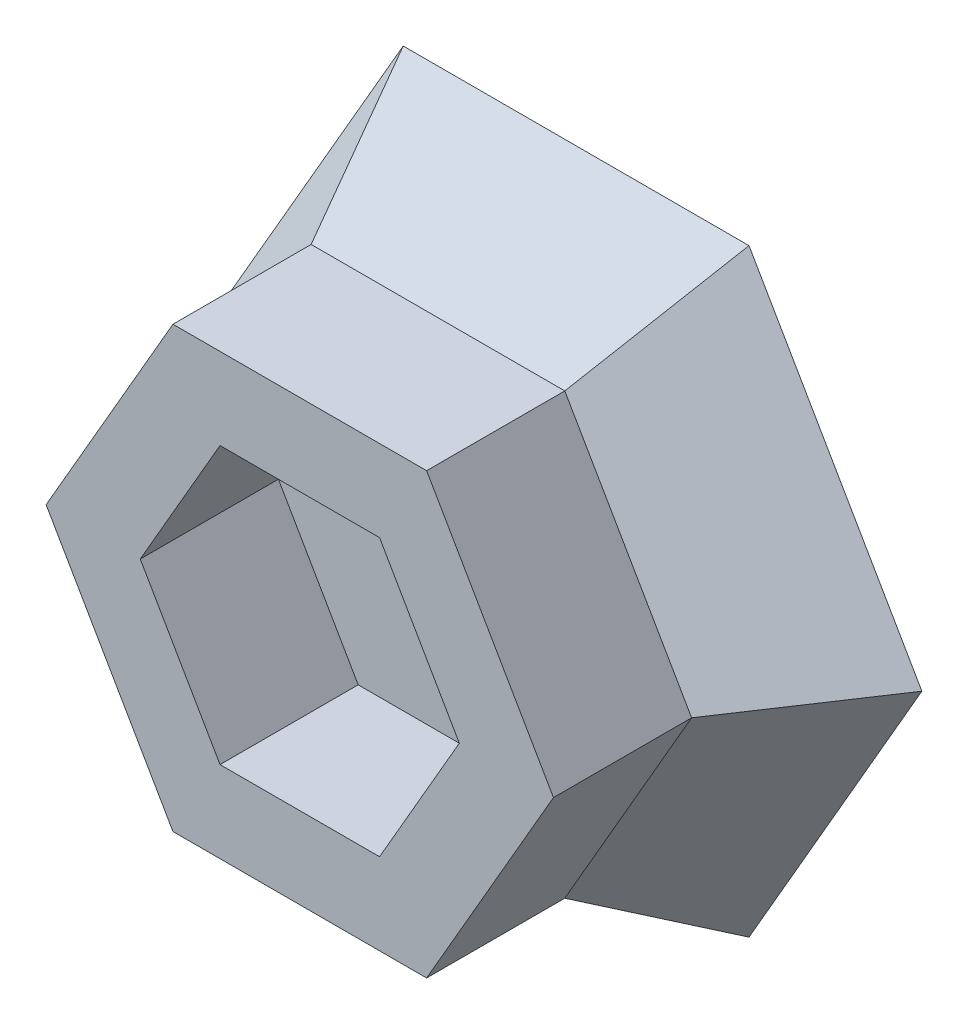
ISO-10303-21;
HEADER;
FILE_DESCRIPTION(('STEP AP214'),'2;1');
FILE_NAME('part.step','',(''),(''),'','','');
FILE_SCHEMA(('AUTOMOTIVE_DESIGN { 1 0 10303 214 1 1 1 1 }'));
ENDSEC;
DATA;
#1=APPLICATION_CONTEXT('core data for automotive mechanical design processes');
#2=APPLICATION_PROTOCOL_DEFINITION('international standard','automotive_design',2000,#1);
#3=PRODUCT_CONTEXT('',#1,'mechanical');
#4=PRODUCT('Part','Part','',(#3));
#5=PRODUCT_RELATED_PRODUCT_CATEGORY('part','',(#4));
#6=PRODUCT_DEFINITION_FORMATION('','',#4);
#7=PRODUCT_DEFINITION_CONTEXT('part definition',#1,'design');
#8=PRODUCT_DEFINITION('design','',#6,#7);
#9=PRODUCT_DEFINITION_SHAPE('','',#8);
#10=(LENGTH_UNIT() NAMED_UNIT(*) SI_UNIT(.MILLI.,.METRE.));
#11=(NAMED_UNIT(*) PLANE_ANGLE_UNIT() SI_UNIT($,.RADIAN.));
#12=(NAMED_UNIT(*) SI_UNIT($,.STERADIAN.) SOLID_ANGLE_UNIT());
#13=UNCERTAINTY_MEASURE_WITH_UNIT(LENGTH_MEASURE(1.E-05),#10,'distance_accuracy_value','');
#14=(GEOMETRIC_REPRESENTATION_CONTEXT(3) GLOBAL_UNCERTAINTY_ASSIGNED_CONTEXT((#13)) GLOBAL_UNIT_ASSIGNED_CONTEXT((#10,
#11,#12)) REPRESENTATION_CONTEXT('',''));
#15=CARTESIAN_POINT('',(0.,0.,0.));
#16=DIRECTION('',(0.,0.,1.));
#17=DIRECTION('',(1.,0.,0.));
#18=AXIS2_PLACEMENT_3D('',#15,#16,#17);
#19=CARTESIAN_POINT('',(0.,0.,5.));
#20=DIRECTION('',(0.,0.,1.));
#21=DIRECTION('',(1.,0.,0.));
#22=AXIS2_PLACEMENT_3D('',#19,#20,#21);
#23=PLANE('',#22);
#24=DIRECTION('',(0.5,0.866025403784439,0.));
#25=VECTOR('',#24,1.);
#26=CARTESIAN_POINT('',(4.58993464005753,-7.95000000000001,5.));
#27=LINE('',#26,#25);
#28=CARTESIAN_POINT('',(4.58993464005753,-7.95000000000001,5.));
#29=VERTEX_POINT('',#28);
#30=CARTESIAN_POINT('',(9.17986928011505,0.,5.));
#31=VERTEX_POINT('',#30);
#32=EDGE_CURVE('E159',#29,#31,#27,.T.);
#33=ORIENTED_EDGE('',*,*,#32,.T.);
#34=DIRECTION('',(-0.5,0.866025403784439,0.));
#35=VECTOR('',#34,1.);
#36=CARTESIAN_POINT('',(9.17986928011505,0.,5.));
#37=LINE('',#36,#35);
#38=CARTESIAN_POINT('',(4.58993464005753,7.95000000000001,5.));
#39=VERTEX_POINT('',#38);
#40=EDGE_CURVE('E170',#31,#39,#37,.T.);
#41=ORIENTED_EDGE('',*,*,#40,.T.);
#42=DIRECTION('',(-1.,0.,0.));
#43=VECTOR('',#42,1.);
#44=CARTESIAN_POINT('',(4.58993464005753,7.95000000000001,5.));
#45=LINE('',#44,#43);
#46=CARTESIAN_POINT('',(-4.58993464005753,7.95000000000001,5.));
#47=VERTEX_POINT('',#46);
#48=EDGE_CURVE('E121',#39,#47,#45,.T.);
#49=ORIENTED_EDGE('',*,*,#48,.T.);
#50=DIRECTION('',(-0.5,-0.866025403784439,0.));
#51=VECTOR('',#50,1.);
#52=CARTESIAN_POINT('',(-4.58993464005753,7.95000000000001,5.));
#53=LINE('',#52,#51);
#54=CARTESIAN_POINT('',(-9.17986928011505,0.,5.));
#55=VERTEX_POINT('',#54);
#56=EDGE_CURVE('E114',#47,#55,#53,.T.);
#57=ORIENTED_EDGE('',*,*,#56,.T.);
#58=DIRECTION('',(0.5,-0.866025403784439,0.));
#59=VECTOR('',#58,1.);
#60=CARTESIAN_POINT('',(-9.17986928011505,0.,5.));
#61=LINE('',#60,#59);
#62=CARTESIAN_POINT('',(-4.58993464005753,-7.95000000000001,5.));
#63=VERTEX_POINT('',#62);
#64=EDGE_CURVE('E118',#55,#63,#61,.T.);
#65=ORIENTED_EDGE('',*,*,#64,.T.);
#66=DIRECTION('',(1.,0.,0.));
#67=VECTOR('',#66,1.);
#68=CARTESIAN_POINT('',(-4.58993464005753,-7.95000000000001,5.));
#69=LINE('',#68,#67);
#70=EDGE_CURVE('E63',#63,#29,#69,.T.);
#71=ORIENTED_EDGE('',*,*,#70,.T.);
#72=EDGE_LOOP('',(#33,#41,#49,#57,#65,#71));
#73=FACE_BOUND('',#72,.T.);
#74=DIRECTION('',(-0.5,0.866025403784438,0.));
#75=VECTOR('',#74,1.);
#76=CARTESIAN_POINT('',(5.77350269189626,0.,5.));
#77=LINE('',#76,#75);
#78=CARTESIAN_POINT('',(5.77350269189626,0.,5.));
#79=VERTEX_POINT('',#78);
#80=CARTESIAN_POINT('',(2.88675134594813,5.,5.));
#81=VERTEX_POINT('',#80);
#82=EDGE_CURVE('E231',#79,#81,#77,.T.);
#83=ORIENTED_EDGE('',*,*,#82,.F.);
#84=DIRECTION('',(0.5,0.866025403784439,0.));
#85=VECTOR('',#84,1.);
#86=CARTESIAN_POINT('',(2.88675134594813,-5.,5.));
#87=LINE('',#86,#85);
#88=CARTESIAN_POINT('',(2.88675134594813,-5.,5.));
#89=VERTEX_POINT('',#88);
#90=EDGE_CURVE('E265',#89,#79,#87,.T.);
#91=ORIENTED_EDGE('',*,*,#90,.F.);
#92=DIRECTION('',(1.,0.,0.));
#93=VECTOR('',#92,1.);
#94=CARTESIAN_POINT('',(-2.88675134594813,-5.,5.));
#95=LINE('',#94,#93);
#96=CARTESIAN_POINT('',(-2.88675134594813,-5.,5.));
#97=VERTEX_POINT('',#96);
#98=EDGE_CURVE('E85',#97,#89,#95,.T.);
#99=ORIENTED_EDGE('',*,*,#98,.F.);
#100=DIRECTION('',(0.5,-0.866025403784439,0.));
#101=VECTOR('',#100,1.);
#102=CARTESIAN_POINT('',(-5.77350269189626,0.,5.));
#103=LINE('',#102,#101);
#104=CARTESIAN_POINT('',(-5.77350269189626,0.,5.));
#105=VERTEX_POINT('',#104);
#106=EDGE_CURVE('E242',#105,#97,#103,.T.);
#107=ORIENTED_EDGE('',*,*,#106,.F.);
#108=DIRECTION('',(-0.5,-0.866025403784439,0.));
#109=VECTOR('',#108,1.);
#110=CARTESIAN_POINT('',(-2.88675134594813,5.,5.));
#111=LINE('',#110,#109);
#112=CARTESIAN_POINT('',(-2.88675134594813,5.,5.));
#113=VERTEX_POINT('',#112);
#114=EDGE_CURVE('E230',#113,#105,#111,.T.);
#115=ORIENTED_EDGE('',*,*,#114,.F.);
#116=DIRECTION('',(-1.,0.,0.));
#117=VECTOR('',#116,1.);
#118=CARTESIAN_POINT('',(2.88675134594813,5.,5.));
#119=LINE('',#118,#117);
#120=EDGE_CURVE('E221',#81,#113,#119,.T.);
#121=ORIENTED_EDGE('',*,*,#120,.F.);
#122=EDGE_LOOP('',(#83,#91,#99,#107,#115,#121));
#123=FACE_BOUND('',#122,.T.);
#124=ADVANCED_FACE('F39',(#73,#123),#23,.T.);
#125=CARTESIAN_POINT('',(4.58993464005753,-7.95000000000001,5.));
#126=DIRECTION('',(-0.866025403784439,0.5,0.));
#127=DIRECTION('',(-0.5,-0.866025403784439,0.));
#128=AXIS2_PLACEMENT_3D('',#125,#126,#127);
#129=PLANE('',#128);
#130=DIRECTION('',(0.5,0.866025403784439,0.));
#131=VECTOR('',#130,1.);
#132=CARTESIAN_POINT('',(4.58993464005753,-7.95000000000001,0.));
#133=LINE('',#132,#131);
#134=CARTESIAN_POINT('',(4.58993464005753,-7.95000000000001,0.));
#135=VERTEX_POINT('',#134);
#136=CARTESIAN_POINT('',(9.17986928011505,0.,0.));
#137=VERTEX_POINT('',#136);
#138=EDGE_CURVE('E145',#135,#137,#133,.T.);
#139=ORIENTED_EDGE('',*,*,#138,.T.);
#140=DIRECTION('',(0.,0.,-1.));
#141=VECTOR('',#140,1.);
#142=CARTESIAN_POINT('',(9.17986928011505,0.,5.));
#143=LINE('',#142,#141);
#144=EDGE_CURVE('E11',#31,#137,#143,.T.);
#145=ORIENTED_EDGE('',*,*,#144,.F.);
#146=ORIENTED_EDGE('',*,*,#32,.F.);
#147=DIRECTION('',(0.,0.,-1.));
#148=VECTOR('',#147,1.);
#149=CARTESIAN_POINT('',(4.58993464005753,-7.95000000000001,5.));
#150=LINE('',#149,#148);
#151=EDGE_CURVE('E141',#29,#135,#150,.T.);
#152=ORIENTED_EDGE('',*,*,#151,.T.);
#153=EDGE_LOOP('',(#139,#145,#146,#152));
#154=FACE_BOUND('',#153,.T.);
#155=ADVANCED_FACE('F41',(#154),#129,.F.);
#156=CARTESIAN_POINT('',(9.17986928011505,0.,5.));
#157=DIRECTION('',(-0.866025403784439,-0.5,0.));
#158=DIRECTION('',(0.5,-0.866025403784439,0.));
#159=AXIS2_PLACEMENT_3D('',#156,#157,#158);
#160=PLANE('',#159);
#161=DIRECTION('',(-0.5,0.866025403784439,0.));
#162=VECTOR('',#161,1.);
#163=CARTESIAN_POINT('',(9.17986928011505,0.,0.));
#164=LINE('',#163,#162);
#165=CARTESIAN_POINT('',(4.58993464005753,7.95000000000001,0.));
#166=VERTEX_POINT('',#165);
#167=EDGE_CURVE('E148',#137,#166,#164,.T.);
#168=ORIENTED_EDGE('',*,*,#167,.T.);
#169=DIRECTION('',(0.,0.,-1.));
#170=VECTOR('',#169,1.);
#171=CARTESIAN_POINT('',(4.58993464005753,7.95000000000001,5.));
#172=LINE('',#171,#170);
#173=EDGE_CURVE('E47',#39,#166,#172,.T.);
#174=ORIENTED_EDGE('',*,*,#173,.F.);
#175=ORIENTED_EDGE('',*,*,#40,.F.);
#176=ORIENTED_EDGE('',*,*,#144,.T.);
#177=EDGE_LOOP('',(#168,#174,#175,#176));
#178=FACE_BOUND('',#177,.T.);
#179=ADVANCED_FACE('F169',(#178),#160,.F.);
#180=CARTESIAN_POINT('',(4.58993464005753,7.95000000000001,5.));
#181=DIRECTION('',(0.,-1.,0.));
#182=DIRECTION('',(1.,0.,0.));
#183=AXIS2_PLACEMENT_3D('',#180,#181,#182);
#184=PLANE('',#183);
#185=DIRECTION('',(-1.,0.,0.));
#186=VECTOR('',#185,1.);
#187=CARTESIAN_POINT('',(4.58993464005753,7.95000000000001,0.));
#188=LINE('',#187,#186);
#189=CARTESIAN_POINT('',(-4.58993464005753,7.95000000000001,0.));
#190=VERTEX_POINT('',#189);
#191=EDGE_CURVE('E76',#166,#190,#188,.T.);
#192=ORIENTED_EDGE('',*,*,#191,.T.);
#193=DIRECTION('',(0.,0.,-1.));
#194=VECTOR('',#193,1.);
#195=CARTESIAN_POINT('',(-4.58993464005753,7.95000000000001,5.));
#196=LINE('',#195,#194);
#197=EDGE_CURVE('E135',#47,#190,#196,.T.);
#198=ORIENTED_EDGE('',*,*,#197,.F.);
#199=ORIENTED_EDGE('',*,*,#48,.F.);
#200=ORIENTED_EDGE('',*,*,#173,.T.);
#201=EDGE_LOOP('',(#192,#198,#199,#200));
#202=FACE_BOUND('',#201,.T.);
#203=ADVANCED_FACE('F166',(#202),#184,.F.);
#204=CARTESIAN_POINT('',(-4.58993464005753,7.95000000000001,5.));
#205=DIRECTION('',(0.866025403784439,-0.5,0.));
#206=DIRECTION('',(0.5,0.866025403784439,0.));
#207=AXIS2_PLACEMENT_3D('',#204,#205,#206);
#208=PLANE('',#207);
#209=DIRECTION('',(-0.5,-0.866025403784439,0.));
#210=VECTOR('',#209,1.);
#211=CARTESIAN_POINT('',(-4.58993464005753,7.95000000000001,0.));
#212=LINE('',#211,#210);
#213=CARTESIAN_POINT('',(-9.17986928011505,0.,0.));
#214=VERTEX_POINT('',#213);
#215=EDGE_CURVE('E132',#190,#214,#212,.T.);
#216=ORIENTED_EDGE('',*,*,#215,.T.);
#217=DIRECTION('',(0.,0.,-1.));
#218=VECTOR('',#217,1.);
#219=CARTESIAN_POINT('',(-9.17986928011505,0.,5.));
#220=LINE('',#219,#218);
#221=EDGE_CURVE('E128',#55,#214,#220,.T.);
#222=ORIENTED_EDGE('',*,*,#221,.F.);
#223=ORIENTED_EDGE('',*,*,#56,.F.);
#224=ORIENTED_EDGE('',*,*,#197,.T.);
#225=EDGE_LOOP('',(#216,#222,#223,#224));
#226=FACE_BOUND('',#225,.T.);
#227=ADVANCED_FACE('F129',(#226),#208,.F.);
#228=CARTESIAN_POINT('',(-9.17986928011505,0.,5.));
#229=DIRECTION('',(0.866025403784439,0.5,0.));
#230=DIRECTION('',(-0.5,0.866025403784439,0.));
#231=AXIS2_PLACEMENT_3D('',#228,#229,#230);
#232=PLANE('',#231);
#233=DIRECTION('',(0.5,-0.866025403784439,0.));
#234=VECTOR('',#233,1.);
#235=CARTESIAN_POINT('',(-9.17986928011505,0.,0.));
#236=LINE('',#235,#234);
#237=CARTESIAN_POINT('',(-4.58993464005753,-7.95000000000001,0.));
#238=VERTEX_POINT('',#237);
#239=EDGE_CURVE('E154',#214,#238,#236,.T.);
#240=ORIENTED_EDGE('',*,*,#239,.T.);
#241=DIRECTION('',(0.,0.,-1.));
#242=VECTOR('',#241,1.);
#243=CARTESIAN_POINT('',(-4.58993464005753,-7.95000000000001,5.));
#244=LINE('',#243,#242);
#245=EDGE_CURVE('E136',#63,#238,#244,.T.);
#246=ORIENTED_EDGE('',*,*,#245,.F.);
#247=ORIENTED_EDGE('',*,*,#64,.F.);
#248=ORIENTED_EDGE('',*,*,#221,.T.);
#249=EDGE_LOOP('',(#240,#246,#247,#248));
#250=FACE_BOUND('',#249,.T.);
#251=ADVANCED_FACE('F138',(#250),#232,.F.);
#252=CARTESIAN_POINT('',(-4.58993464005753,-7.95000000000001,5.));
#253=DIRECTION('',(0.,1.,0.));
#254=DIRECTION('',(0.,0.,1.));
#255=AXIS2_PLACEMENT_3D('',#252,#253,#254);
#256=PLANE('',#255);
#257=DIRECTION('',(1.,0.,0.));
#258=VECTOR('',#257,1.);
#259=CARTESIAN_POINT('',(-4.58993464005753,-7.95000000000001,0.));
#260=LINE('',#259,#258);
#261=EDGE_CURVE('E156',#238,#135,#260,.T.);
#262=ORIENTED_EDGE('',*,*,#261,.T.);
#263=ORIENTED_EDGE('',*,*,#151,.F.);
#264=ORIENTED_EDGE('',*,*,#70,.F.);
#265=ORIENTED_EDGE('',*,*,#245,.T.);
#266=EDGE_LOOP('',(#262,#263,#264,#265));
#267=FACE_BOUND('',#266,.T.);
#268=ADVANCED_FACE('F280',(#267),#256,.F.);
#269=CARTESIAN_POINT('',(2.88675134594813,-5.,5.));
#270=DIRECTION('',(-0.866025403784439,0.5,0.));
#271=DIRECTION('',(-0.5,-0.866025403784439,0.));
#272=AXIS2_PLACEMENT_3D('',#269,#270,#271);
#273=PLANE('',#272);
#274=DIRECTION('',(0.5,0.866025403784439,0.));
#275=VECTOR('',#274,1.);
#276=CARTESIAN_POINT('',(2.88675134594813,-5.,0.));
#277=LINE('',#276,#275);
#278=CARTESIAN_POINT('',(2.88675134594813,-5.,0.));
#279=VERTEX_POINT('',#278);
#280=CARTESIAN_POINT('',(5.77350269189626,0.,0.));
#281=VERTEX_POINT('',#280);
#282=EDGE_CURVE('E249',#279,#281,#277,.T.);
#283=ORIENTED_EDGE('',*,*,#282,.F.);
#284=DIRECTION('',(0.,0.,-1.));
#285=VECTOR('',#284,1.);
#286=CARTESIAN_POINT('',(2.88675134594813,-5.,5.));
#287=LINE('',#286,#285);
#288=EDGE_CURVE('E248',#89,#279,#287,.T.);
#289=ORIENTED_EDGE('',*,*,#288,.F.);
#290=ORIENTED_EDGE('',*,*,#90,.T.);
#291=DIRECTION('',(0.,0.,-1.));
#292=VECTOR('',#291,1.);
#293=CARTESIAN_POINT('',(5.77350269189626,0.,5.));
#294=LINE('',#293,#292);
#295=EDGE_CURVE('E149',#79,#281,#294,.T.);
#296=ORIENTED_EDGE('',*,*,#295,.T.);
#297=EDGE_LOOP('',(#283,#289,#290,#296));
#298=FACE_BOUND('',#297,.T.);
#299=ADVANCED_FACE('F319',(#298),#273,.T.);
#300=CARTESIAN_POINT('',(5.77350269189626,0.,5.));
#301=DIRECTION('',(-0.866025403784438,-0.5,0.));
#302=DIRECTION('',(0.5,-0.866025403784438,0.));
#303=AXIS2_PLACEMENT_3D('',#300,#301,#302);
#304=PLANE('',#303);
#305=DIRECTION('',(-0.5,0.866025403784438,0.));
#306=VECTOR('',#305,1.);
#307=CARTESIAN_POINT('',(5.77350269189626,0.,0.));
#308=LINE('',#307,#306);
#309=CARTESIAN_POINT('',(2.88675134594813,5.,0.));
#310=VERTEX_POINT('',#309);
#311=EDGE_CURVE('E252',#281,#310,#308,.T.);
#312=ORIENTED_EDGE('',*,*,#311,.F.);
#313=ORIENTED_EDGE('',*,*,#295,.F.);
#314=ORIENTED_EDGE('',*,*,#82,.T.);
#315=DIRECTION('',(0.,0.,-1.));
#316=VECTOR('',#315,1.);
#317=CARTESIAN_POINT('',(2.88675134594813,5.,5.));
#318=LINE('',#317,#316);
#319=EDGE_CURVE('E227',#81,#310,#318,.T.);
#320=ORIENTED_EDGE('',*,*,#319,.T.);
#321=EDGE_LOOP('',(#312,#313,#314,#320));
#322=FACE_BOUND('',#321,.T.);
#323=ADVANCED_FACE('F315',(#322),#304,.T.);
#324=CARTESIAN_POINT('',(2.88675134594813,5.,5.));
#325=DIRECTION('',(0.,-1.,0.));
#326=DIRECTION('',(0.,0.,-1.));
#327=AXIS2_PLACEMENT_3D('',#324,#325,#326);
#328=PLANE('',#327);
#329=DIRECTION('',(-1.,0.,0.));
#330=VECTOR('',#329,1.);
#331=CARTESIAN_POINT('',(2.88675134594813,5.,0.));
#332=LINE('',#331,#330);
#333=CARTESIAN_POINT('',(-2.88675134594813,5.,0.));
#334=VERTEX_POINT('',#333);
#335=EDGE_CURVE('E256',#310,#334,#332,.T.);
#336=ORIENTED_EDGE('',*,*,#335,.F.);
#337=ORIENTED_EDGE('',*,*,#319,.F.);
#338=ORIENTED_EDGE('',*,*,#120,.T.);
#339=DIRECTION('',(0.,0.,-1.));
#340=VECTOR('',#339,1.);
#341=CARTESIAN_POINT('',(-2.88675134594813,5.,5.));
#342=LINE('',#341,#340);
#343=EDGE_CURVE('E225',#113,#334,#342,.T.);
#344=ORIENTED_EDGE('',*,*,#343,.T.);
#345=EDGE_LOOP('',(#336,#337,#338,#344));
#346=FACE_BOUND('',#345,.T.);
#347=ADVANCED_FACE('F224',(#346),#328,.T.);
#348=CARTESIAN_POINT('',(-2.88675134594813,5.,5.));
#349=DIRECTION('',(0.866025403784439,-0.5,0.));
#350=DIRECTION('',(0.5,0.866025403784439,0.));
#351=AXIS2_PLACEMENT_3D('',#348,#349,#350);
#352=PLANE('',#351);
#353=DIRECTION('',(-0.5,-0.866025403784439,0.));
#354=VECTOR('',#353,1.);
#355=CARTESIAN_POINT('',(-2.88675134594813,5.,0.));
#356=LINE('',#355,#354);
#357=CARTESIAN_POINT('',(-5.77350269189626,0.,0.));
#358=VERTEX_POINT('',#357);
#359=EDGE_CURVE('E237',#334,#358,#356,.T.);
#360=ORIENTED_EDGE('',*,*,#359,.F.);
#361=ORIENTED_EDGE('',*,*,#343,.F.);
#362=ORIENTED_EDGE('',*,*,#114,.T.);
#363=DIRECTION('',(0.,0.,-1.));
#364=VECTOR('',#363,1.);
#365=CARTESIAN_POINT('',(-5.77350269189626,0.,5.));
#366=LINE('',#365,#364);
#367=EDGE_CURVE('E239',#105,#358,#366,.T.);
#368=ORIENTED_EDGE('',*,*,#367,.T.);
#369=EDGE_LOOP('',(#360,#361,#362,#368));
#370=FACE_BOUND('',#369,.T.);
#371=ADVANCED_FACE('F234',(#370),#352,.T.);
#372=CARTESIAN_POINT('',(-5.77350269189626,0.,5.));
#373=DIRECTION('',(0.866025403784438,0.5,0.));
#374=DIRECTION('',(-0.5,0.866025403784439,0.));
#375=AXIS2_PLACEMENT_3D('',#372,#373,#374);
#376=PLANE('',#375);
#377=DIRECTION('',(0.5,-0.866025403784439,0.));
#378=VECTOR('',#377,1.);
#379=CARTESIAN_POINT('',(-5.77350269189626,0.,0.));
#380=LINE('',#379,#378);
#381=CARTESIAN_POINT('',(-2.88675134594813,-5.,0.));
#382=VERTEX_POINT('',#381);
#383=EDGE_CURVE('E259',#358,#382,#380,.T.);
#384=ORIENTED_EDGE('',*,*,#383,.F.);
#385=ORIENTED_EDGE('',*,*,#367,.F.);
#386=ORIENTED_EDGE('',*,*,#106,.T.);
#387=DIRECTION('',(0.,0.,-1.));
#388=VECTOR('',#387,1.);
#389=CARTESIAN_POINT('',(-2.88675134594813,-5.,5.));
#390=LINE('',#389,#388);
#391=EDGE_CURVE('E54',#97,#382,#390,.T.);
#392=ORIENTED_EDGE('',*,*,#391,.T.);
#393=EDGE_LOOP('',(#384,#385,#386,#392));
#394=FACE_BOUND('',#393,.T.);
#395=ADVANCED_FACE('F325',(#394),#376,.T.);
#396=CARTESIAN_POINT('',(-2.88675134594813,-5.,5.));
#397=DIRECTION('',(0.,1.,0.));
#398=DIRECTION('',(0.,0.,1.));
#399=AXIS2_PLACEMENT_3D('',#396,#397,#398);
#400=PLANE('',#399);
#401=DIRECTION('',(1.,0.,0.));
#402=VECTOR('',#401,1.);
#403=CARTESIAN_POINT('',(-2.88675134594813,-5.,0.));
#404=LINE('',#403,#402);
#405=EDGE_CURVE('E262',#382,#279,#404,.T.);
#406=ORIENTED_EDGE('',*,*,#405,.F.);
#407=ORIENTED_EDGE('',*,*,#391,.F.);
#408=ORIENTED_EDGE('',*,*,#98,.T.);
#409=ORIENTED_EDGE('',*,*,#288,.T.);
#410=EDGE_LOOP('',(#406,#407,#408,#409));
#411=FACE_BOUND('',#410,.T.);
#412=ADVANCED_FACE('F320',(#411),#400,.T.);
#413=CARTESIAN_POINT('',(0.,0.,0.));
#414=DIRECTION('',(0.,0.,1.));
#415=DIRECTION('',(1.,0.,0.));
#416=AXIS2_PLACEMENT_3D('',#413,#414,#415);
#417=PLANE('',#416);
#418=ORIENTED_EDGE('',*,*,#405,.T.);
#419=ORIENTED_EDGE('',*,*,#282,.T.);
#420=ORIENTED_EDGE('',*,*,#311,.T.);
#421=ORIENTED_EDGE('',*,*,#335,.T.);
#422=ORIENTED_EDGE('',*,*,#359,.T.);
#423=ORIENTED_EDGE('',*,*,#383,.T.);
#424=EDGE_LOOP('',(#418,#419,#420,#421,#422,#423));
#425=FACE_BOUND('',#424,.T.);
#426=ADVANCED_FACE('F323',(#425),#417,.T.);
#427=CARTESIAN_POINT('',(0.,-7.95000000000001,0.));
#428=DIRECTION('',(0.,-0.866025403784438,0.500000000000001));
#429=DIRECTION('',(0.,-0.500000000000001,-0.866025403784438));
#430=AXIS2_PLACEMENT_3D('',#427,#428,#429);
#431=PLANE('',#430);
#432=ORIENTED_EDGE('',*,*,#261,.F.);
#433=DIRECTION('',(0.277350098112615,0.480384461415262,0.832050294337843));
#434=VECTOR('',#433,1.);
#435=CARTESIAN_POINT('',(-4.23686274466848,-7.33846153846154,1.05921568616712));
#436=LINE('',#435,#434);
#437=CARTESIAN_POINT('',(-6.2566013067242,-10.8367513459481,-5.));
#438=VERTEX_POINT('',#437);
#439=EDGE_CURVE('E253',#438,#238,#436,.T.);
#440=ORIENTED_EDGE('',*,*,#439,.F.);
#441=DIRECTION('',(1.,0.,0.));
#442=VECTOR('',#441,1.);
#443=CARTESIAN_POINT('',(0.,-10.8367513459481,-5.));
#444=LINE('',#443,#442);
#445=CARTESIAN_POINT('',(6.2566013067242,-10.8367513459481,-5.));
#446=VERTEX_POINT('',#445);
#447=EDGE_CURVE('E301',#438,#446,#444,.T.);
#448=ORIENTED_EDGE('',*,*,#447,.T.);
#449=DIRECTION('',(-0.277350098112615,0.480384461415262,0.832050294337843));
#450=VECTOR('',#449,1.);
#451=CARTESIAN_POINT('',(4.23686274466849,-7.33846153846154,1.05921568616712));
#452=LINE('',#451,#450);
#453=EDGE_CURVE('E276',#446,#135,#452,.T.);
#454=ORIENTED_EDGE('',*,*,#453,.T.);
#455=EDGE_LOOP('',(#432,#440,#448,#454));
#456=FACE_BOUND('',#455,.T.);
#457=ADVANCED_FACE('F282',(#456),#431,.T.);
#458=CARTESIAN_POINT('',(-6.88490196008629,-3.975,0.));
#459=DIRECTION('',(-0.75,-0.433012701892219,0.500000000000001));
#460=DIRECTION('',(0.55470019622523,0.,0.832050294337843));
#461=AXIS2_PLACEMENT_3D('',#458,#459,#460);
#462=PLANE('',#461);
#463=ORIENTED_EDGE('',*,*,#239,.F.);
#464=DIRECTION('',(0.55470019622523,0.,0.832050294337843));
#465=VECTOR('',#464,1.);
#466=CARTESIAN_POINT('',(-8.47372548933697,0.,1.05921568616712));
#467=LINE('',#466,#465);
#468=CARTESIAN_POINT('',(-12.5132026134484,0.,-5.));
#469=VERTEX_POINT('',#468);
#470=EDGE_CURVE('E289',#469,#214,#467,.T.);
#471=ORIENTED_EDGE('',*,*,#470,.F.);
#472=DIRECTION('',(0.5,-0.866025403784439,0.));
#473=VECTOR('',#472,1.);
#474=CARTESIAN_POINT('',(-9.3849019600863,-5.41837567297407,-5.));
#475=LINE('',#474,#473);
#476=EDGE_CURVE('E292',#469,#438,#475,.T.);
#477=ORIENTED_EDGE('',*,*,#476,.T.);
#478=ORIENTED_EDGE('',*,*,#439,.T.);
#479=EDGE_LOOP('',(#463,#471,#477,#478));
#480=FACE_BOUND('',#479,.T.);
#481=ADVANCED_FACE('F287',(#480),#462,.T.);
#482=CARTESIAN_POINT('',(-6.88490196008629,3.975,0.));
#483=DIRECTION('',(-0.75,0.433012701892219,0.500000000000001));
#484=DIRECTION('',(0.55470019622523,0.,0.832050294337843));
#485=AXIS2_PLACEMENT_3D('',#482,#483,#484);
#486=PLANE('',#485);
#487=ORIENTED_EDGE('',*,*,#215,.F.);
#488=DIRECTION('',(0.277350098112615,-0.480384461415262,0.832050294337843));
#489=VECTOR('',#488,1.);
#490=CARTESIAN_POINT('',(-4.23686274466849,7.33846153846154,1.05921568616712));
#491=LINE('',#490,#489);
#492=CARTESIAN_POINT('',(-6.2566013067242,10.8367513459481,-5.));
#493=VERTEX_POINT('',#492);
#494=EDGE_CURVE('E294',#493,#190,#491,.T.);
#495=ORIENTED_EDGE('',*,*,#494,.F.);
#496=DIRECTION('',(-0.5,-0.866025403784439,0.));
#497=VECTOR('',#496,1.);
#498=CARTESIAN_POINT('',(-9.3849019600863,5.41837567297407,-5.));
#499=LINE('',#498,#497);
#500=EDGE_CURVE('E305',#493,#469,#499,.T.);
#501=ORIENTED_EDGE('',*,*,#500,.T.);
#502=ORIENTED_EDGE('',*,*,#470,.T.);
#503=EDGE_LOOP('',(#487,#495,#501,#502));
#504=FACE_BOUND('',#503,.T.);
#505=ADVANCED_FACE('F430',(#504),#486,.T.);
#506=CARTESIAN_POINT('',(0.,7.95000000000001,0.));
#507=DIRECTION('',(0.,0.866025403784438,0.500000000000001));
#508=DIRECTION('',(0.,-0.500000000000001,0.866025403784438));
#509=AXIS2_PLACEMENT_3D('',#506,#507,#508);
#510=PLANE('',#509);
#511=ORIENTED_EDGE('',*,*,#191,.F.);
#512=DIRECTION('',(-0.277350098112615,-0.480384461415262,0.832050294337843));
#513=VECTOR('',#512,1.);
#514=CARTESIAN_POINT('',(4.23686274466848,7.33846153846154,1.05921568616712));
#515=LINE('',#514,#513);
#516=CARTESIAN_POINT('',(6.2566013067242,10.8367513459481,-5.));
#517=VERTEX_POINT('',#516);
#518=EDGE_CURVE('E182',#517,#166,#515,.T.);
#519=ORIENTED_EDGE('',*,*,#518,.F.);
#520=DIRECTION('',(-1.,0.,0.));
#521=VECTOR('',#520,1.);
#522=CARTESIAN_POINT('',(0.,10.8367513459481,-5.));
#523=LINE('',#522,#521);
#524=EDGE_CURVE('E307',#517,#493,#523,.T.);
#525=ORIENTED_EDGE('',*,*,#524,.T.);
#526=ORIENTED_EDGE('',*,*,#494,.T.);
#527=EDGE_LOOP('',(#511,#519,#525,#526));
#528=FACE_BOUND('',#527,.T.);
#529=ADVANCED_FACE('F440',(#528),#510,.T.);
#530=CARTESIAN_POINT('',(6.88490196008629,3.975,0.));
#531=DIRECTION('',(0.75,0.433012701892219,0.500000000000001));
#532=DIRECTION('',(0.55470019622523,0.,-0.832050294337843));
#533=AXIS2_PLACEMENT_3D('',#530,#531,#532);
#534=PLANE('',#533);
#535=ORIENTED_EDGE('',*,*,#167,.F.);
#536=DIRECTION('',(-0.55470019622523,0.,0.832050294337843));
#537=VECTOR('',#536,1.);
#538=CARTESIAN_POINT('',(8.47372548933697,0.,1.05921568616712));
#539=LINE('',#538,#537);
#540=CARTESIAN_POINT('',(12.5132026134484,0.,-5.));
#541=VERTEX_POINT('',#540);
#542=EDGE_CURVE('E180',#541,#137,#539,.T.);
#543=ORIENTED_EDGE('',*,*,#542,.F.);
#544=DIRECTION('',(-0.5,0.866025403784439,0.));
#545=VECTOR('',#544,1.);
#546=CARTESIAN_POINT('',(9.3849019600863,5.41837567297407,-5.));
#547=LINE('',#546,#545);
#548=EDGE_CURVE('E310',#541,#517,#547,.T.);
#549=ORIENTED_EDGE('',*,*,#548,.T.);
#550=ORIENTED_EDGE('',*,*,#518,.T.);
#551=EDGE_LOOP('',(#535,#543,#549,#550));
#552=FACE_BOUND('',#551,.T.);
#553=ADVANCED_FACE('F176',(#552),#534,.T.);
#554=CARTESIAN_POINT('',(6.88490196008629,-3.975,0.));
#555=DIRECTION('',(0.75,-0.433012701892219,0.500000000000001));
#556=DIRECTION('',(0.55470019622523,0.,-0.832050294337843));
#557=AXIS2_PLACEMENT_3D('',#554,#555,#556);
#558=PLANE('',#557);
#559=ORIENTED_EDGE('',*,*,#138,.F.);
#560=ORIENTED_EDGE('',*,*,#453,.F.);
#561=DIRECTION('',(0.5,0.866025403784439,0.));
#562=VECTOR('',#561,1.);
#563=CARTESIAN_POINT('',(9.3849019600863,-5.41837567297407,-5.));
#564=LINE('',#563,#562);
#565=EDGE_CURVE('E303',#446,#541,#564,.T.);
#566=ORIENTED_EDGE('',*,*,#565,.T.);
#567=ORIENTED_EDGE('',*,*,#542,.T.);
#568=EDGE_LOOP('',(#559,#560,#566,#567));
#569=FACE_BOUND('',#568,.T.);
#570=ADVANCED_FACE('F275',(#569),#558,.T.);
#571=CARTESIAN_POINT('',(0.,0.,-5.));
#572=DIRECTION('',(0.,0.,1.));
#573=DIRECTION('',(1.,0.,0.));
#574=AXIS2_PLACEMENT_3D('',#571,#572,#573);
#575=PLANE('',#574);
#576=ORIENTED_EDGE('',*,*,#447,.F.);
#577=ORIENTED_EDGE('',*,*,#476,.F.);
#578=ORIENTED_EDGE('',*,*,#500,.F.);
#579=ORIENTED_EDGE('',*,*,#524,.F.);
#580=ORIENTED_EDGE('',*,*,#548,.F.);
#581=ORIENTED_EDGE('',*,*,#565,.F.);
#582=EDGE_LOOP('',(#576,#577,#578,#579,#580,#581));
#583=FACE_BOUND('',#582,.T.);
#584=ADVANCED_FACE('F469',(#583),#575,.F.);
#585=CLOSED_SHELL('',(#124,#155,#179,#203,#227,#251,#268,#299,#323,#347,#371,#395,#412,#426,
#457,#481,#505,#529,#553,#570,#584));
#586=MANIFOLD_SOLID_BREP('B2',#585);
#587=ADVANCED_BREP_SHAPE_REPRESENTATION('',(#18,#586),#14);
#588=SHAPE_DEFINITION_REPRESENTATION(#9,#587);
ENDSEC;
END-ISO-10303-21;
